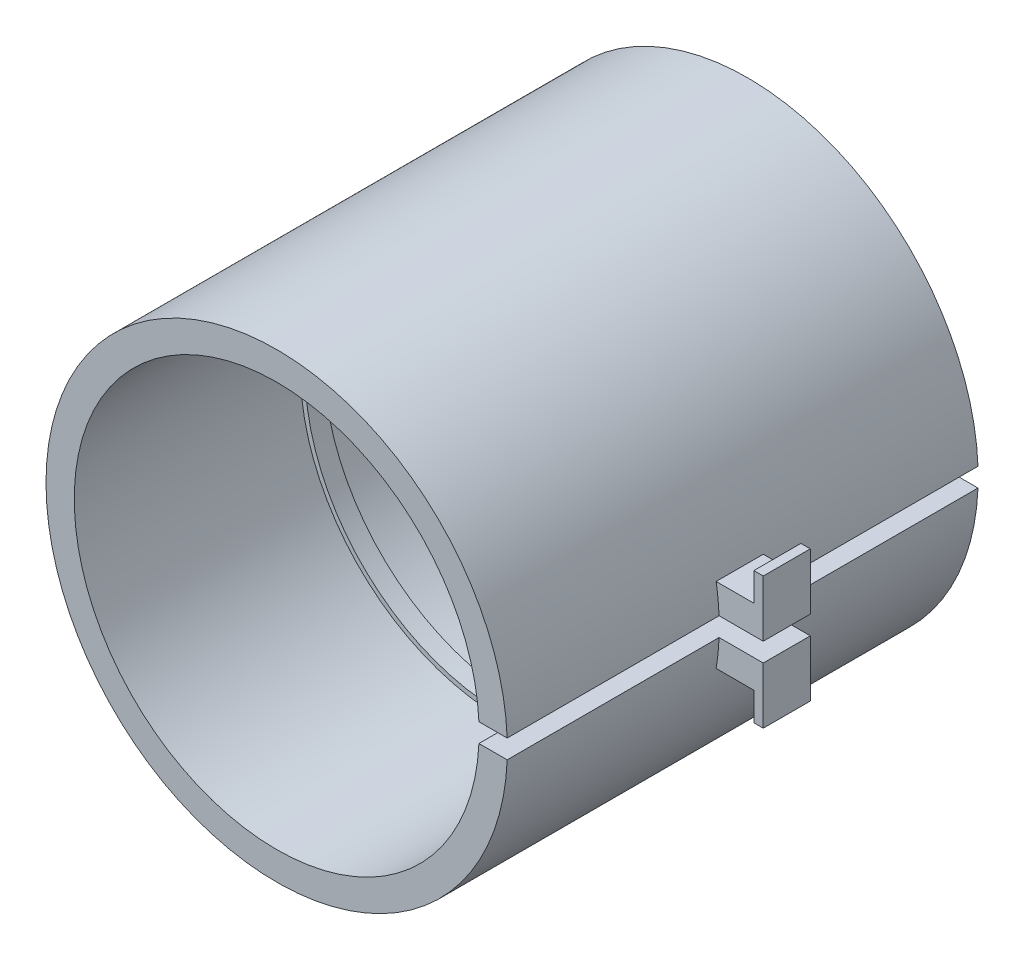
ISO-10303-21;
HEADER;
FILE_DESCRIPTION(('STEP AP214'),'2;1');
FILE_NAME('part.step','',(''),(''),'','','');
FILE_SCHEMA(('AUTOMOTIVE_DESIGN { 1 0 10303 214 1 1 1 1 }'));
ENDSEC;
DATA;
#1=APPLICATION_CONTEXT('core data for automotive mechanical design processes');
#2=APPLICATION_PROTOCOL_DEFINITION('international standard','automotive_design',2000,#1);
#3=PRODUCT_CONTEXT('',#1,'mechanical');
#4=PRODUCT('Part','Part','',(#3));
#5=PRODUCT_RELATED_PRODUCT_CATEGORY('part','',(#4));
#6=PRODUCT_DEFINITION_FORMATION('','',#4);
#7=PRODUCT_DEFINITION_CONTEXT('part definition',#1,'design');
#8=PRODUCT_DEFINITION('design','',#6,#7);
#9=PRODUCT_DEFINITION_SHAPE('','',#8);
#10=(LENGTH_UNIT() NAMED_UNIT(*) SI_UNIT(.MILLI.,.METRE.));
#11=(NAMED_UNIT(*) PLANE_ANGLE_UNIT() SI_UNIT($,.RADIAN.));
#12=(NAMED_UNIT(*) SI_UNIT($,.STERADIAN.) SOLID_ANGLE_UNIT());
#13=UNCERTAINTY_MEASURE_WITH_UNIT(LENGTH_MEASURE(1.E-05),#10,'distance_accuracy_value','');
#14=(GEOMETRIC_REPRESENTATION_CONTEXT(3) GLOBAL_UNCERTAINTY_ASSIGNED_CONTEXT((#13)) GLOBAL_UNIT_ASSIGNED_CONTEXT((#10,
#11,#12)) REPRESENTATION_CONTEXT('',''));
#15=CARTESIAN_POINT('',(0.,0.,0.));
#16=DIRECTION('',(0.,0.,1.));
#17=DIRECTION('',(1.,0.,0.));
#18=AXIS2_PLACEMENT_3D('',#15,#16,#17);
#19=CARTESIAN_POINT('',(29.1712639305436,4.,27.5));
#20=DIRECTION('',(0.,-1.,0.));
#21=DIRECTION('',(1.,0.,0.));
#22=AXIS2_PLACEMENT_3D('',#19,#20,#21);
#23=PLANE('',#22);
#24=DIRECTION('',(0.,0.,1.));
#25=VECTOR('',#24,1.);
#26=CARTESIAN_POINT('',(28.1712639305436,4.,27.5));
#27=LINE('',#26,#25);
#28=CARTESIAN_POINT('',(28.1712639305436,4.,22.5));
#29=VERTEX_POINT('',#28);
#30=CARTESIAN_POINT('',(28.1712639305436,4.,27.5));
#31=VERTEX_POINT('',#30);
#32=EDGE_CURVE('E212',#29,#31,#27,.T.);
#33=ORIENTED_EDGE('',*,*,#32,.F.);
#34=DIRECTION('',(-1.,0.,0.));
#35=VECTOR('',#34,1.);
#36=CARTESIAN_POINT('',(29.1712639305436,4.,22.5));
#37=LINE('',#36,#35);
#38=CARTESIAN_POINT('',(24.1712639305436,4.,22.5));
#39=VERTEX_POINT('',#38);
#40=EDGE_CURVE('E278',#29,#39,#37,.T.);
#41=ORIENTED_EDGE('',*,*,#40,.T.);
#42=DIRECTION('',(0.,0.,-1.));
#43=VECTOR('',#42,1.);
#44=CARTESIAN_POINT('',(24.1712639305436,4.,27.5));
#45=LINE('',#44,#43);
#46=CARTESIAN_POINT('',(24.1712639305436,4.,27.5));
#47=VERTEX_POINT('',#46);
#48=EDGE_CURVE('E284',#47,#39,#45,.T.);
#49=ORIENTED_EDGE('',*,*,#48,.F.);
#50=DIRECTION('',(-1.,0.,0.));
#51=VECTOR('',#50,1.);
#52=CARTESIAN_POINT('',(29.1712639305436,4.,27.5));
#53=LINE('',#52,#51);
#54=EDGE_CURVE('E282',#31,#47,#53,.T.);
#55=ORIENTED_EDGE('',*,*,#54,.F.);
#56=EDGE_LOOP('',(#33,#41,#49,#55));
#57=FACE_BOUND('',#56,.T.);
#58=ADVANCED_FACE('F41',(#57),#23,.F.);
#59=CARTESIAN_POINT('',(0.,0.,50.));
#60=DIRECTION('',(0.,0.,-1.));
#61=DIRECTION('',(-1.,0.,0.));
#62=AXIS2_PLACEMENT_3D('',#59,#60,#61);
#63=CYLINDRICAL_SURFACE('',#62,21.5);
#64=DIRECTION('',(0.,0.,-1.));
#65=VECTOR('',#64,1.);
#66=CARTESIAN_POINT('',(21.4767315949145,1.,50.));
#67=LINE('',#66,#65);
#68=CARTESIAN_POINT('',(21.4767315949145,1.,24.));
#69=VERTEX_POINT('',#68);
#70=CARTESIAN_POINT('',(21.4767315949145,1.,0.));
#71=VERTEX_POINT('',#70);
#72=EDGE_CURVE('E310',#69,#71,#67,.T.);
#73=ORIENTED_EDGE('',*,*,#72,.F.);
#74=CARTESIAN_POINT('',(0.,0.,24.));
#75=DIRECTION('',(0.,0.,1.));
#76=DIRECTION('',(1.,0.,0.));
#77=AXIS2_PLACEMENT_3D('',#74,#75,#76);
#78=CIRCLE('',#77,21.5);
#79=CARTESIAN_POINT('',(21.4767315949145,-1.,24.));
#80=VERTEX_POINT('',#79);
#81=EDGE_CURVE('E249',#69,#80,#78,.T.);
#82=ORIENTED_EDGE('',*,*,#81,.T.);
#83=DIRECTION('',(0.,0.,-1.));
#84=VECTOR('',#83,1.);
#85=CARTESIAN_POINT('',(21.4767315949145,-1.,50.));
#86=LINE('',#85,#84);
#87=CARTESIAN_POINT('',(21.4767315949145,-1.,0.));
#88=VERTEX_POINT('',#87);
#89=EDGE_CURVE('E324',#80,#88,#86,.T.);
#90=ORIENTED_EDGE('',*,*,#89,.T.);
#91=CARTESIAN_POINT('',(0.,0.,0.));
#92=DIRECTION('',(0.,0.,1.));
#93=DIRECTION('',(1.,0.,0.));
#94=AXIS2_PLACEMENT_3D('',#91,#92,#93);
#95=CIRCLE('',#94,21.5);
#96=EDGE_CURVE('E302',#71,#88,#95,.T.);
#97=ORIENTED_EDGE('',*,*,#96,.F.);
#98=EDGE_LOOP('',(#73,#82,#90,#97));
#99=FACE_BOUND('',#98,.T.);
#100=ADVANCED_FACE('F348',(#99),#63,.F.);
#101=CARTESIAN_POINT('',(0.,0.,50.));
#102=DIRECTION('',(0.,0.,-1.));
#103=DIRECTION('',(-1.,0.,0.));
#104=AXIS2_PLACEMENT_3D('',#101,#102,#103);
#105=CYLINDRICAL_SURFACE('',#104,24.5);
#106=DIRECTION('',(0.,0.,-1.));
#107=VECTOR('',#106,1.);
#108=CARTESIAN_POINT('',(24.1712639305436,-4.,27.5));
#109=LINE('',#108,#107);
#110=CARTESIAN_POINT('',(24.1712639305436,-4.,27.5));
#111=VERTEX_POINT('',#110);
#112=CARTESIAN_POINT('',(24.1712639305436,-4.,22.5));
#113=VERTEX_POINT('',#112);
#114=EDGE_CURVE('E257',#111,#113,#109,.T.);
#115=ORIENTED_EDGE('',*,*,#114,.F.);
#116=CARTESIAN_POINT('',(0.,0.,27.5));
#117=DIRECTION('',(0.,0.,-1.));
#118=DIRECTION('',(1.,0.,0.));
#119=AXIS2_PLACEMENT_3D('',#116,#117,#118);
#120=CIRCLE('',#119,24.5);
#121=CARTESIAN_POINT('',(24.4795833297873,-1.,27.5));
#122=VERTEX_POINT('',#121);
#123=EDGE_CURVE('E264',#122,#111,#120,.T.);
#124=ORIENTED_EDGE('',*,*,#123,.F.);
#125=DIRECTION('',(0.,0.,-1.));
#126=VECTOR('',#125,1.);
#127=CARTESIAN_POINT('',(24.4795833297873,-1.,50.));
#128=LINE('',#127,#126);
#129=CARTESIAN_POINT('',(24.4795833297873,-1.,50.));
#130=VERTEX_POINT('',#129);
#131=EDGE_CURVE('E328',#130,#122,#128,.T.);
#132=ORIENTED_EDGE('',*,*,#131,.F.);
#133=CARTESIAN_POINT('',(0.,0.,50.));
#134=DIRECTION('',(0.,0.,1.));
#135=DIRECTION('',(1.,0.,0.));
#136=AXIS2_PLACEMENT_3D('',#133,#134,#135);
#137=CIRCLE('',#136,24.5);
#138=CARTESIAN_POINT('',(24.4795833297873,1.,50.));
#139=VERTEX_POINT('',#138);
#140=EDGE_CURVE('E301',#139,#130,#137,.T.);
#141=ORIENTED_EDGE('',*,*,#140,.F.);
#142=DIRECTION('',(0.,0.,-1.));
#143=VECTOR('',#142,1.);
#144=CARTESIAN_POINT('',(24.4795833297873,1.,50.));
#145=LINE('',#144,#143);
#146=CARTESIAN_POINT('',(24.4795833297873,1.,27.5));
#147=VERTEX_POINT('',#146);
#148=EDGE_CURVE('E11',#139,#147,#145,.T.);
#149=ORIENTED_EDGE('',*,*,#148,.T.);
#150=CARTESIAN_POINT('',(0.,0.,27.5));
#151=DIRECTION('',(0.,0.,-1.));
#152=DIRECTION('',(-1.,0.,0.));
#153=AXIS2_PLACEMENT_3D('',#150,#151,#152);
#154=CIRCLE('',#153,24.5);
#155=EDGE_CURVE('E274',#47,#147,#154,.T.);
#156=ORIENTED_EDGE('',*,*,#155,.F.);
#157=ORIENTED_EDGE('',*,*,#48,.T.);
#158=CARTESIAN_POINT('',(0.,0.,22.5));
#159=DIRECTION('',(0.,0.,-1.));
#160=DIRECTION('',(-1.,0.,0.));
#161=AXIS2_PLACEMENT_3D('',#158,#159,#160);
#162=CIRCLE('',#161,24.5);
#163=CARTESIAN_POINT('',(24.4795833297873,1.,22.5));
#164=VERTEX_POINT('',#163);
#165=EDGE_CURVE('E270',#39,#164,#162,.T.);
#166=ORIENTED_EDGE('',*,*,#165,.T.);
#167=CARTESIAN_POINT('',(24.4795833297873,1.,0.));
#168=VERTEX_POINT('',#167);
#169=EDGE_CURVE('E49',#164,#168,#145,.T.);
#170=ORIENTED_EDGE('',*,*,#169,.T.);
#171=CARTESIAN_POINT('',(0.,0.,0.));
#172=DIRECTION('',(0.,0.,1.));
#173=DIRECTION('',(1.,0.,0.));
#174=AXIS2_PLACEMENT_3D('',#171,#172,#173);
#175=CIRCLE('',#174,24.5);
#176=CARTESIAN_POINT('',(24.4795833297873,-1.,0.));
#177=VERTEX_POINT('',#176);
#178=EDGE_CURVE('E313',#168,#177,#175,.T.);
#179=ORIENTED_EDGE('',*,*,#178,.T.);
#180=CARTESIAN_POINT('',(24.4795833297873,-1.,22.5));
#181=VERTEX_POINT('',#180);
#182=EDGE_CURVE('E327',#181,#177,#128,.T.);
#183=ORIENTED_EDGE('',*,*,#182,.F.);
#184=CARTESIAN_POINT('',(0.,0.,22.5));
#185=DIRECTION('',(0.,0.,-1.));
#186=DIRECTION('',(1.,0.,0.));
#187=AXIS2_PLACEMENT_3D('',#184,#185,#186);
#188=CIRCLE('',#187,24.5);
#189=EDGE_CURVE('E267',#181,#113,#188,.T.);
#190=ORIENTED_EDGE('',*,*,#189,.T.);
#191=EDGE_LOOP('',(#115,#124,#132,#141,#149,#156,#157,#166,#170,#179,#183,#190));
#192=FACE_BOUND('',#191,.T.);
#193=ADVANCED_FACE('F340',(#192),#105,.T.);
#194=CARTESIAN_POINT('',(0.,1.,50.));
#195=DIRECTION('',(0.,1.,0.));
#196=DIRECTION('',(0.,0.,1.));
#197=AXIS2_PLACEMENT_3D('',#194,#195,#196);
#198=PLANE('',#197);
#199=DIRECTION('',(1.,0.,0.));
#200=VECTOR('',#199,1.);
#201=CARTESIAN_POINT('',(0.,1.,0.));
#202=LINE('',#201,#200);
#203=EDGE_CURVE('E297',#71,#168,#202,.T.);
#204=ORIENTED_EDGE('',*,*,#203,.T.);
#205=ORIENTED_EDGE('',*,*,#169,.F.);
#206=DIRECTION('',(1.,0.,0.));
#207=VECTOR('',#206,1.);
#208=CARTESIAN_POINT('',(24.4795833297873,1.,22.5));
#209=LINE('',#208,#207);
#210=CARTESIAN_POINT('',(29.1712639305436,1.,22.5));
#211=VERTEX_POINT('',#210);
#212=EDGE_CURVE('E287',#164,#211,#209,.T.);
#213=ORIENTED_EDGE('',*,*,#212,.T.);
#214=DIRECTION('',(0.,0.,-1.));
#215=VECTOR('',#214,1.);
#216=CARTESIAN_POINT('',(29.1712639305436,1.,27.5));
#217=LINE('',#216,#215);
#218=CARTESIAN_POINT('',(29.1712639305436,1.,27.5));
#219=VERTEX_POINT('',#218);
#220=EDGE_CURVE('E294',#219,#211,#217,.T.);
#221=ORIENTED_EDGE('',*,*,#220,.F.);
#222=DIRECTION('',(1.,0.,0.));
#223=VECTOR('',#222,1.);
#224=CARTESIAN_POINT('',(24.4795833297873,1.,27.5));
#225=LINE('',#224,#223);
#226=EDGE_CURVE('E277',#147,#219,#225,.T.);
#227=ORIENTED_EDGE('',*,*,#226,.F.);
#228=ORIENTED_EDGE('',*,*,#148,.F.);
#229=DIRECTION('',(1.,0.,0.));
#230=VECTOR('',#229,1.);
#231=CARTESIAN_POINT('',(0.,1.,50.));
#232=LINE('',#231,#230);
#233=CARTESIAN_POINT('',(21.4767315949145,1.,50.));
#234=VERTEX_POINT('',#233);
#235=EDGE_CURVE('E298',#234,#139,#232,.T.);
#236=ORIENTED_EDGE('',*,*,#235,.F.);
#237=CARTESIAN_POINT('',(21.4767315949145,1.,26.));
#238=VERTEX_POINT('',#237);
#239=EDGE_CURVE('E321',#234,#238,#67,.T.);
#240=ORIENTED_EDGE('',*,*,#239,.T.);
#241=DIRECTION('',(-1.,0.,0.));
#242=VECTOR('',#241,1.);
#243=CARTESIAN_POINT('',(0.,1.,26.));
#244=LINE('',#243,#242);
#245=CARTESIAN_POINT('',(20.976176963403,1.,26.));
#246=VERTEX_POINT('',#245);
#247=EDGE_CURVE('E235',#238,#246,#244,.T.);
#248=ORIENTED_EDGE('',*,*,#247,.T.);
#249=DIRECTION('',(0.,0.,-1.));
#250=VECTOR('',#249,1.);
#251=CARTESIAN_POINT('',(20.976176963403,1.,26.));
#252=LINE('',#251,#250);
#253=CARTESIAN_POINT('',(20.976176963403,1.,24.));
#254=VERTEX_POINT('',#253);
#255=EDGE_CURVE('E255',#246,#254,#252,.T.);
#256=ORIENTED_EDGE('',*,*,#255,.T.);
#257=DIRECTION('',(-1.,0.,0.));
#258=VECTOR('',#257,1.);
#259=CARTESIAN_POINT('',(0.,1.,24.));
#260=LINE('',#259,#258);
#261=EDGE_CURVE('E246',#69,#254,#260,.T.);
#262=ORIENTED_EDGE('',*,*,#261,.F.);
#263=ORIENTED_EDGE('',*,*,#72,.T.);
#264=EDGE_LOOP('',(#204,#205,#213,#221,#227,#228,#236,#240,#248,#256,#262,#263));
#265=FACE_BOUND('',#264,.T.);
#266=ADVANCED_FACE('F43',(#265),#198,.F.);
#267=CARTESIAN_POINT('',(0.,-0.999999999999999,50.));
#268=DIRECTION('',(0.,1.,0.));
#269=DIRECTION('',(-1.,0.,0.));
#270=AXIS2_PLACEMENT_3D('',#267,#268,#269);
#271=PLANE('',#270);
#272=DIRECTION('',(1.,0.,0.));
#273=VECTOR('',#272,1.);
#274=CARTESIAN_POINT('',(0.,-0.999999999999999,0.));
#275=LINE('',#274,#273);
#276=EDGE_CURVE('E316',#88,#177,#275,.T.);
#277=ORIENTED_EDGE('',*,*,#276,.F.);
#278=ORIENTED_EDGE('',*,*,#89,.F.);
#279=DIRECTION('',(-1.,0.,0.));
#280=VECTOR('',#279,1.);
#281=CARTESIAN_POINT('',(0.,-1.,24.));
#282=LINE('',#281,#280);
#283=CARTESIAN_POINT('',(20.976176963403,-1.,24.));
#284=VERTEX_POINT('',#283);
#285=EDGE_CURVE('E236',#80,#284,#282,.T.);
#286=ORIENTED_EDGE('',*,*,#285,.T.);
#287=DIRECTION('',(0.,0.,-1.));
#288=VECTOR('',#287,1.);
#289=CARTESIAN_POINT('',(20.976176963403,-1.,26.));
#290=LINE('',#289,#288);
#291=CARTESIAN_POINT('',(20.976176963403,-1.,26.));
#292=VERTEX_POINT('',#291);
#293=EDGE_CURVE('E243',#292,#284,#290,.T.);
#294=ORIENTED_EDGE('',*,*,#293,.F.);
#295=DIRECTION('',(-1.,0.,0.));
#296=VECTOR('',#295,1.);
#297=CARTESIAN_POINT('',(0.,-1.,26.));
#298=LINE('',#297,#296);
#299=CARTESIAN_POINT('',(21.4767315949145,-1.,26.));
#300=VERTEX_POINT('',#299);
#301=EDGE_CURVE('E241',#300,#292,#298,.T.);
#302=ORIENTED_EDGE('',*,*,#301,.F.);
#303=CARTESIAN_POINT('',(21.4767315949145,-1.,50.));
#304=VERTEX_POINT('',#303);
#305=EDGE_CURVE('E325',#304,#300,#86,.T.);
#306=ORIENTED_EDGE('',*,*,#305,.F.);
#307=DIRECTION('',(1.,0.,0.));
#308=VECTOR('',#307,1.);
#309=CARTESIAN_POINT('',(0.,-0.999999999999999,50.));
#310=LINE('',#309,#308);
#311=EDGE_CURVE('E304',#304,#130,#310,.T.);
#312=ORIENTED_EDGE('',*,*,#311,.T.);
#313=ORIENTED_EDGE('',*,*,#131,.T.);
#314=DIRECTION('',(-1.,0.,0.));
#315=VECTOR('',#314,1.);
#316=CARTESIAN_POINT('',(24.4795833297873,-1.,27.5));
#317=LINE('',#316,#315);
#318=CARTESIAN_POINT('',(29.1712639305436,-1.,27.5));
#319=VERTEX_POINT('',#318);
#320=EDGE_CURVE('E188',#319,#122,#317,.T.);
#321=ORIENTED_EDGE('',*,*,#320,.F.);
#322=DIRECTION('',(0.,0.,-1.));
#323=VECTOR('',#322,1.);
#324=CARTESIAN_POINT('',(29.1712639305436,-1.,27.5));
#325=LINE('',#324,#323);
#326=CARTESIAN_POINT('',(29.1712639305436,-1.,22.5));
#327=VERTEX_POINT('',#326);
#328=EDGE_CURVE('E183',#319,#327,#325,.T.);
#329=ORIENTED_EDGE('',*,*,#328,.T.);
#330=DIRECTION('',(-1.,0.,0.));
#331=VECTOR('',#330,1.);
#332=CARTESIAN_POINT('',(24.4795833297873,-1.,22.5));
#333=LINE('',#332,#331);
#334=EDGE_CURVE('E260',#327,#181,#333,.T.);
#335=ORIENTED_EDGE('',*,*,#334,.T.);
#336=ORIENTED_EDGE('',*,*,#182,.T.);
#337=EDGE_LOOP('',(#277,#278,#286,#294,#302,#306,#312,#313,#321,#329,#335,#336));
#338=FACE_BOUND('',#337,.T.);
#339=ADVANCED_FACE('F334',(#338),#271,.T.);
#340=CARTESIAN_POINT('',(0.,0.,26.));
#341=DIRECTION('',(0.,0.,1.));
#342=DIRECTION('',(1.,0.,0.));
#343=AXIS2_PLACEMENT_3D('',#340,#341,#342);
#344=CIRCLE('',#343,21.5);
#345=EDGE_CURVE('E239',#238,#300,#344,.T.);
#346=ORIENTED_EDGE('',*,*,#345,.F.);
#347=ORIENTED_EDGE('',*,*,#239,.F.);
#348=CARTESIAN_POINT('',(0.,0.,50.));
#349=DIRECTION('',(0.,0.,1.));
#350=DIRECTION('',(1.,0.,0.));
#351=AXIS2_PLACEMENT_3D('',#348,#349,#350);
#352=CIRCLE('',#351,21.5);
#353=EDGE_CURVE('E307',#234,#304,#352,.T.);
#354=ORIENTED_EDGE('',*,*,#353,.T.);
#355=ORIENTED_EDGE('',*,*,#305,.T.);
#356=EDGE_LOOP('',(#346,#347,#354,#355));
#357=FACE_BOUND('',#356,.T.);
#358=ADVANCED_FACE('F366',(#357),#63,.F.);
#359=CARTESIAN_POINT('',(0.,0.,50.));
#360=DIRECTION('',(0.,0.,1.));
#361=DIRECTION('',(1.,0.,0.));
#362=AXIS2_PLACEMENT_3D('',#359,#360,#361);
#363=PLANE('',#362);
#364=ORIENTED_EDGE('',*,*,#235,.T.);
#365=ORIENTED_EDGE('',*,*,#140,.T.);
#366=ORIENTED_EDGE('',*,*,#311,.F.);
#367=ORIENTED_EDGE('',*,*,#353,.F.);
#368=EDGE_LOOP('',(#364,#365,#366,#367));
#369=FACE_BOUND('',#368,.T.);
#370=ADVANCED_FACE('F369',(#369),#363,.T.);
#371=CARTESIAN_POINT('',(0.,0.,0.));
#372=DIRECTION('',(0.,0.,1.));
#373=DIRECTION('',(1.,0.,0.));
#374=AXIS2_PLACEMENT_3D('',#371,#372,#373);
#375=PLANE('',#374);
#376=ORIENTED_EDGE('',*,*,#203,.F.);
#377=ORIENTED_EDGE('',*,*,#96,.T.);
#378=ORIENTED_EDGE('',*,*,#276,.T.);
#379=ORIENTED_EDGE('',*,*,#178,.F.);
#380=EDGE_LOOP('',(#376,#377,#378,#379));
#381=FACE_BOUND('',#380,.T.);
#382=ADVANCED_FACE('F344',(#381),#375,.F.);
#383=CARTESIAN_POINT('',(29.1712639305436,1.,27.5));
#384=DIRECTION('',(-1.,0.,0.));
#385=DIRECTION('',(0.,0.,1.));
#386=AXIS2_PLACEMENT_3D('',#383,#384,#385);
#387=PLANE('',#386);
#388=DIRECTION('',(0.,1.,0.));
#389=VECTOR('',#388,1.);
#390=CARTESIAN_POINT('',(29.1712639305436,1.,22.5));
#391=LINE('',#390,#389);
#392=CARTESIAN_POINT('',(29.1712639305436,7.,22.5));
#393=VERTEX_POINT('',#392);
#394=EDGE_CURVE('E289',#211,#393,#391,.T.);
#395=ORIENTED_EDGE('',*,*,#394,.T.);
#396=DIRECTION('',(0.,0.,-1.));
#397=VECTOR('',#396,1.);
#398=CARTESIAN_POINT('',(29.1712639305436,7.,27.5));
#399=LINE('',#398,#397);
#400=CARTESIAN_POINT('',(29.1712639305436,7.,27.5));
#401=VERTEX_POINT('',#400);
#402=EDGE_CURVE('E213',#401,#393,#399,.T.);
#403=ORIENTED_EDGE('',*,*,#402,.F.);
#404=DIRECTION('',(0.,1.,0.));
#405=VECTOR('',#404,1.);
#406=CARTESIAN_POINT('',(29.1712639305436,1.,27.5));
#407=LINE('',#406,#405);
#408=EDGE_CURVE('E280',#219,#401,#407,.T.);
#409=ORIENTED_EDGE('',*,*,#408,.F.);
#410=ORIENTED_EDGE('',*,*,#220,.T.);
#411=EDGE_LOOP('',(#395,#403,#409,#410));
#412=FACE_BOUND('',#411,.T.);
#413=ADVANCED_FACE('F399',(#412),#387,.F.);
#414=CARTESIAN_POINT('',(0.,0.,27.5));
#415=DIRECTION('',(0.,0.,-1.));
#416=DIRECTION('',(-1.,0.,0.));
#417=AXIS2_PLACEMENT_3D('',#414,#415,#416);
#418=PLANE('',#417);
#419=ORIENTED_EDGE('',*,*,#155,.T.);
#420=ORIENTED_EDGE('',*,*,#226,.T.);
#421=ORIENTED_EDGE('',*,*,#408,.T.);
#422=DIRECTION('',(1.,0.,0.));
#423=VECTOR('',#422,1.);
#424=CARTESIAN_POINT('',(29.1712639305436,7.,27.5));
#425=LINE('',#424,#423);
#426=CARTESIAN_POINT('',(28.1712639305436,7.,27.5));
#427=VERTEX_POINT('',#426);
#428=EDGE_CURVE('E220',#427,#401,#425,.T.);
#429=ORIENTED_EDGE('',*,*,#428,.F.);
#430=DIRECTION('',(0.,-1.,0.));
#431=VECTOR('',#430,1.);
#432=CARTESIAN_POINT('',(28.1712639305436,7.,27.5));
#433=LINE('',#432,#431);
#434=EDGE_CURVE('E223',#427,#31,#433,.T.);
#435=ORIENTED_EDGE('',*,*,#434,.T.);
#436=ORIENTED_EDGE('',*,*,#54,.T.);
#437=EDGE_LOOP('',(#419,#420,#421,#429,#435,#436));
#438=FACE_BOUND('',#437,.T.);
#439=ADVANCED_FACE('F383',(#438),#418,.F.);
#440=CARTESIAN_POINT('',(0.,0.,22.5));
#441=DIRECTION('',(0.,0.,-1.));
#442=DIRECTION('',(-1.,0.,0.));
#443=AXIS2_PLACEMENT_3D('',#440,#441,#442);
#444=PLANE('',#443);
#445=ORIENTED_EDGE('',*,*,#165,.F.);
#446=ORIENTED_EDGE('',*,*,#40,.F.);
#447=DIRECTION('',(0.,-1.,0.));
#448=VECTOR('',#447,1.);
#449=CARTESIAN_POINT('',(28.1712639305436,7.,22.5));
#450=LINE('',#449,#448);
#451=CARTESIAN_POINT('',(28.1712639305436,7.,22.5));
#452=VERTEX_POINT('',#451);
#453=EDGE_CURVE('E228',#452,#29,#450,.T.);
#454=ORIENTED_EDGE('',*,*,#453,.F.);
#455=DIRECTION('',(-1.,0.,0.));
#456=VECTOR('',#455,1.);
#457=CARTESIAN_POINT('',(29.1712639305436,7.,22.5));
#458=LINE('',#457,#456);
#459=EDGE_CURVE('E216',#393,#452,#458,.T.);
#460=ORIENTED_EDGE('',*,*,#459,.F.);
#461=ORIENTED_EDGE('',*,*,#394,.F.);
#462=ORIENTED_EDGE('',*,*,#212,.F.);
#463=EDGE_LOOP('',(#445,#446,#454,#460,#461,#462));
#464=FACE_BOUND('',#463,.T.);
#465=ADVANCED_FACE('F375',(#464),#444,.T.);
#466=CARTESIAN_POINT('',(29.1712639305436,-4.,27.5));
#467=DIRECTION('',(0.,1.,0.));
#468=DIRECTION('',(-1.,0.,0.));
#469=AXIS2_PLACEMENT_3D('',#466,#467,#468);
#470=PLANE('',#469);
#471=DIRECTION('',(1.,0.,0.));
#472=VECTOR('',#471,1.);
#473=CARTESIAN_POINT('',(29.1712639305436,-4.,22.5));
#474=LINE('',#473,#472);
#475=CARTESIAN_POINT('',(28.1712639305436,-4.,22.5));
#476=VERTEX_POINT('',#475);
#477=EDGE_CURVE('E61',#113,#476,#474,.T.);
#478=ORIENTED_EDGE('',*,*,#477,.T.);
#479=DIRECTION('',(0.,0.,1.));
#480=VECTOR('',#479,1.);
#481=CARTESIAN_POINT('',(28.1712639305436,-4.,27.5));
#482=LINE('',#481,#480);
#483=CARTESIAN_POINT('',(28.1712639305436,-4.,27.5));
#484=VERTEX_POINT('',#483);
#485=EDGE_CURVE('E56',#476,#484,#482,.T.);
#486=ORIENTED_EDGE('',*,*,#485,.T.);
#487=DIRECTION('',(1.,0.,0.));
#488=VECTOR('',#487,1.);
#489=CARTESIAN_POINT('',(29.1712639305436,-4.,27.5));
#490=LINE('',#489,#488);
#491=EDGE_CURVE('E187',#111,#484,#490,.T.);
#492=ORIENTED_EDGE('',*,*,#491,.F.);
#493=ORIENTED_EDGE('',*,*,#114,.T.);
#494=EDGE_LOOP('',(#478,#486,#492,#493));
#495=FACE_BOUND('',#494,.T.);
#496=ADVANCED_FACE('F373',(#495),#470,.F.);
#497=CARTESIAN_POINT('',(29.1712639305436,-1.,27.5));
#498=DIRECTION('',(-1.,0.,0.));
#499=DIRECTION('',(0.,0.,1.));
#500=AXIS2_PLACEMENT_3D('',#497,#498,#499);
#501=PLANE('',#500);
#502=DIRECTION('',(0.,1.,0.));
#503=VECTOR('',#502,1.);
#504=CARTESIAN_POINT('',(29.1712639305436,-1.,22.5));
#505=LINE('',#504,#503);
#506=CARTESIAN_POINT('',(29.1712639305436,-7.,22.5));
#507=VERTEX_POINT('',#506);
#508=EDGE_CURVE('E263',#507,#327,#505,.T.);
#509=ORIENTED_EDGE('',*,*,#508,.T.);
#510=ORIENTED_EDGE('',*,*,#328,.F.);
#511=DIRECTION('',(0.,1.,0.));
#512=VECTOR('',#511,1.);
#513=CARTESIAN_POINT('',(29.1712639305436,-1.,27.5));
#514=LINE('',#513,#512);
#515=CARTESIAN_POINT('',(29.1712639305436,-7.,27.5));
#516=VERTEX_POINT('',#515);
#517=EDGE_CURVE('E177',#516,#319,#514,.T.);
#518=ORIENTED_EDGE('',*,*,#517,.F.);
#519=DIRECTION('',(0.,0.,-1.));
#520=VECTOR('',#519,1.);
#521=CARTESIAN_POINT('',(29.1712639305436,-7.,27.5));
#522=LINE('',#521,#520);
#523=EDGE_CURVE('E180',#516,#507,#522,.T.);
#524=ORIENTED_EDGE('',*,*,#523,.T.);
#525=EDGE_LOOP('',(#509,#510,#518,#524));
#526=FACE_BOUND('',#525,.T.);
#527=ADVANCED_FACE('F179',(#526),#501,.F.);
#528=CARTESIAN_POINT('',(0.,0.,27.5));
#529=DIRECTION('',(0.,0.,1.));
#530=DIRECTION('',(1.,0.,0.));
#531=AXIS2_PLACEMENT_3D('',#528,#529,#530);
#532=PLANE('',#531);
#533=ORIENTED_EDGE('',*,*,#123,.T.);
#534=ORIENTED_EDGE('',*,*,#491,.T.);
#535=DIRECTION('',(0.,1.,0.));
#536=VECTOR('',#535,1.);
#537=CARTESIAN_POINT('',(28.1712639305436,-7.,27.5));
#538=LINE('',#537,#536);
#539=CARTESIAN_POINT('',(28.1712639305436,-7.,27.5));
#540=VERTEX_POINT('',#539);
#541=EDGE_CURVE('E202',#540,#484,#538,.T.);
#542=ORIENTED_EDGE('',*,*,#541,.F.);
#543=DIRECTION('',(1.,0.,0.));
#544=VECTOR('',#543,1.);
#545=CARTESIAN_POINT('',(29.1712639305436,-7.,27.5));
#546=LINE('',#545,#544);
#547=EDGE_CURVE('E194',#540,#516,#546,.T.);
#548=ORIENTED_EDGE('',*,*,#547,.T.);
#549=ORIENTED_EDGE('',*,*,#517,.T.);
#550=ORIENTED_EDGE('',*,*,#320,.T.);
#551=EDGE_LOOP('',(#533,#534,#542,#548,#549,#550));
#552=FACE_BOUND('',#551,.T.);
#553=ADVANCED_FACE('F200',(#552),#532,.T.);
#554=CARTESIAN_POINT('',(0.,0.,22.5));
#555=DIRECTION('',(0.,0.,1.));
#556=DIRECTION('',(1.,0.,0.));
#557=AXIS2_PLACEMENT_3D('',#554,#555,#556);
#558=PLANE('',#557);
#559=ORIENTED_EDGE('',*,*,#189,.F.);
#560=ORIENTED_EDGE('',*,*,#334,.F.);
#561=ORIENTED_EDGE('',*,*,#508,.F.);
#562=DIRECTION('',(-1.,0.,0.));
#563=VECTOR('',#562,1.);
#564=CARTESIAN_POINT('',(29.1712639305436,-7.,22.5));
#565=LINE('',#564,#563);
#566=CARTESIAN_POINT('',(28.1712639305436,-7.,22.5));
#567=VERTEX_POINT('',#566);
#568=EDGE_CURVE('E197',#507,#567,#565,.T.);
#569=ORIENTED_EDGE('',*,*,#568,.T.);
#570=DIRECTION('',(0.,1.,0.));
#571=VECTOR('',#570,1.);
#572=CARTESIAN_POINT('',(28.1712639305436,-7.,22.5));
#573=LINE('',#572,#571);
#574=EDGE_CURVE('E208',#567,#476,#573,.T.);
#575=ORIENTED_EDGE('',*,*,#574,.T.);
#576=ORIENTED_EDGE('',*,*,#477,.F.);
#577=EDGE_LOOP('',(#559,#560,#561,#569,#575,#576));
#578=FACE_BOUND('',#577,.T.);
#579=ADVANCED_FACE('F372',(#578),#558,.F.);
#580=CARTESIAN_POINT('',(0.,0.,26.));
#581=DIRECTION('',(0.,0.,-1.));
#582=DIRECTION('',(-1.,0.,0.));
#583=AXIS2_PLACEMENT_3D('',#580,#581,#582);
#584=CYLINDRICAL_SURFACE('',#583,21.);
#585=CARTESIAN_POINT('',(0.,0.,24.));
#586=DIRECTION('',(0.,0.,1.));
#587=DIRECTION('',(1.,0.,0.));
#588=AXIS2_PLACEMENT_3D('',#585,#586,#587);
#589=CIRCLE('',#588,21.);
#590=EDGE_CURVE('E231',#254,#284,#589,.T.);
#591=ORIENTED_EDGE('',*,*,#590,.F.);
#592=ORIENTED_EDGE('',*,*,#255,.F.);
#593=CARTESIAN_POINT('',(0.,0.,26.));
#594=DIRECTION('',(0.,0.,1.));
#595=DIRECTION('',(1.,0.,0.));
#596=AXIS2_PLACEMENT_3D('',#593,#594,#595);
#597=CIRCLE('',#596,21.);
#598=EDGE_CURVE('E232',#246,#292,#597,.T.);
#599=ORIENTED_EDGE('',*,*,#598,.T.);
#600=ORIENTED_EDGE('',*,*,#293,.T.);
#601=EDGE_LOOP('',(#591,#592,#599,#600));
#602=FACE_BOUND('',#601,.T.);
#603=ADVANCED_FACE('F356',(#602),#584,.F.);
#604=CARTESIAN_POINT('',(0.,0.,26.));
#605=DIRECTION('',(0.,0.,1.));
#606=DIRECTION('',(1.,0.,0.));
#607=AXIS2_PLACEMENT_3D('',#604,#605,#606);
#608=PLANE('',#607);
#609=ORIENTED_EDGE('',*,*,#598,.F.);
#610=ORIENTED_EDGE('',*,*,#247,.F.);
#611=ORIENTED_EDGE('',*,*,#345,.T.);
#612=ORIENTED_EDGE('',*,*,#301,.T.);
#613=EDGE_LOOP('',(#609,#610,#611,#612));
#614=FACE_BOUND('',#613,.T.);
#615=ADVANCED_FACE('F359',(#614),#608,.T.);
#616=CARTESIAN_POINT('',(0.,0.,24.));
#617=DIRECTION('',(0.,0.,1.));
#618=DIRECTION('',(1.,0.,0.));
#619=AXIS2_PLACEMENT_3D('',#616,#617,#618);
#620=PLANE('',#619);
#621=ORIENTED_EDGE('',*,*,#590,.T.);
#622=ORIENTED_EDGE('',*,*,#285,.F.);
#623=ORIENTED_EDGE('',*,*,#81,.F.);
#624=ORIENTED_EDGE('',*,*,#261,.T.);
#625=EDGE_LOOP('',(#621,#622,#623,#624));
#626=FACE_BOUND('',#625,.T.);
#627=ADVANCED_FACE('F353',(#626),#620,.F.);
#628=CARTESIAN_POINT('',(28.1712639305436,7.,27.5));
#629=DIRECTION('',(1.,0.,0.));
#630=DIRECTION('',(0.,1.,0.));
#631=AXIS2_PLACEMENT_3D('',#628,#629,#630);
#632=PLANE('',#631);
#633=ORIENTED_EDGE('',*,*,#32,.T.);
#634=ORIENTED_EDGE('',*,*,#434,.F.);
#635=DIRECTION('',(0.,0.,1.));
#636=VECTOR('',#635,1.);
#637=CARTESIAN_POINT('',(28.1712639305436,7.,27.5));
#638=LINE('',#637,#636);
#639=EDGE_CURVE('E218',#452,#427,#638,.T.);
#640=ORIENTED_EDGE('',*,*,#639,.F.);
#641=ORIENTED_EDGE('',*,*,#453,.T.);
#642=EDGE_LOOP('',(#633,#634,#640,#641));
#643=FACE_BOUND('',#642,.T.);
#644=ADVANCED_FACE('F447',(#643),#632,.F.);
#645=CARTESIAN_POINT('',(0.,7.,0.));
#646=DIRECTION('',(0.,1.,0.));
#647=DIRECTION('',(0.,0.,1.));
#648=AXIS2_PLACEMENT_3D('',#645,#646,#647);
#649=PLANE('',#648);
#650=ORIENTED_EDGE('',*,*,#402,.T.);
#651=ORIENTED_EDGE('',*,*,#459,.T.);
#652=ORIENTED_EDGE('',*,*,#639,.T.);
#653=ORIENTED_EDGE('',*,*,#428,.T.);
#654=EDGE_LOOP('',(#650,#651,#652,#653));
#655=FACE_BOUND('',#654,.T.);
#656=ADVANCED_FACE('F489',(#655),#649,.T.);
#657=CARTESIAN_POINT('',(28.1712639305436,-7.,27.5));
#658=DIRECTION('',(-1.,0.,0.));
#659=DIRECTION('',(0.,-1.,0.));
#660=AXIS2_PLACEMENT_3D('',#657,#658,#659);
#661=PLANE('',#660);
#662=ORIENTED_EDGE('',*,*,#485,.F.);
#663=ORIENTED_EDGE('',*,*,#574,.F.);
#664=DIRECTION('',(0.,0.,1.));
#665=VECTOR('',#664,1.);
#666=CARTESIAN_POINT('',(28.1712639305436,-7.,27.5));
#667=LINE('',#666,#665);
#668=EDGE_CURVE('E203',#567,#540,#667,.T.);
#669=ORIENTED_EDGE('',*,*,#668,.T.);
#670=ORIENTED_EDGE('',*,*,#541,.T.);
#671=EDGE_LOOP('',(#662,#663,#669,#670));
#672=FACE_BOUND('',#671,.T.);
#673=ADVANCED_FACE('F498',(#672),#661,.T.);
#674=CARTESIAN_POINT('',(0.,-7.,0.));
#675=DIRECTION('',(0.,-1.,0.));
#676=DIRECTION('',(0.,0.,1.));
#677=AXIS2_PLACEMENT_3D('',#674,#675,#676);
#678=PLANE('',#677);
#679=ORIENTED_EDGE('',*,*,#523,.F.);
#680=ORIENTED_EDGE('',*,*,#547,.F.);
#681=ORIENTED_EDGE('',*,*,#668,.F.);
#682=ORIENTED_EDGE('',*,*,#568,.F.);
#683=EDGE_LOOP('',(#679,#680,#681,#682));
#684=FACE_BOUND('',#683,.T.);
#685=ADVANCED_FACE('F192',(#684),#678,.T.);
#686=CLOSED_SHELL('',(#58,#100,#193,#266,#339,#358,#370,#382,#413,#439,#465,#496,#527,#553,#579,
#603,#615,#627,#644,#656,#673,#685));
#687=MANIFOLD_SOLID_BREP('B2',#686);
#688=ADVANCED_BREP_SHAPE_REPRESENTATION('',(#18,#687),#14);
#689=SHAPE_DEFINITION_REPRESENTATION(#9,#688);
ENDSEC;
END-ISO-10303-21;
